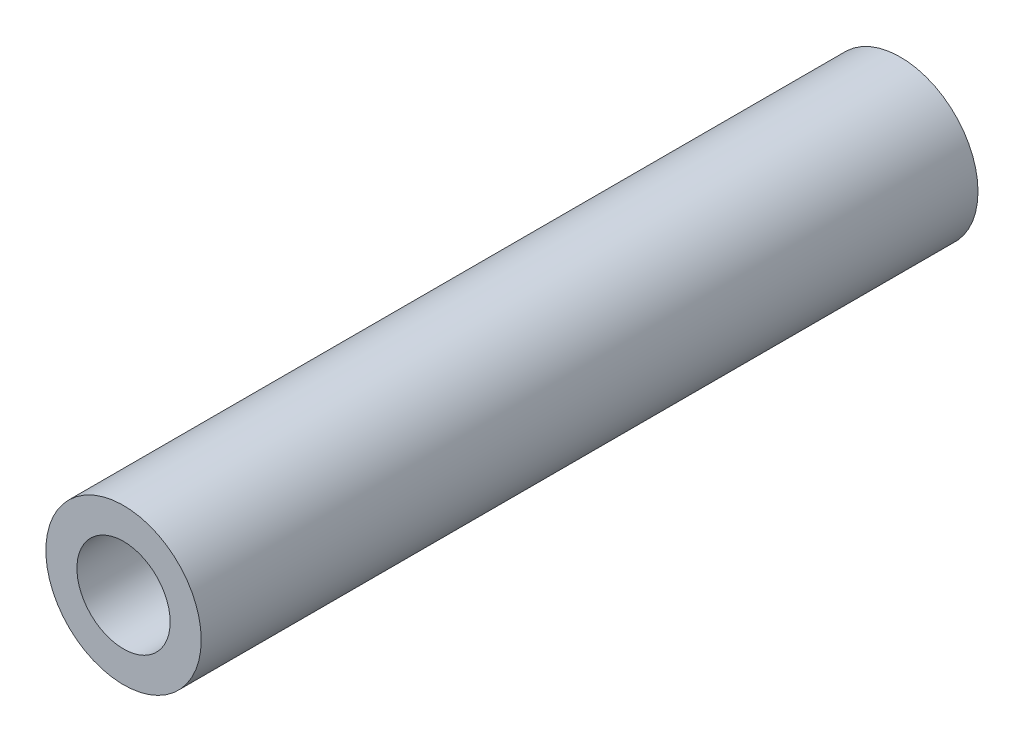
ISO-10303-21;
HEADER;
FILE_DESCRIPTION(('STEP AP214'),'2;1');
FILE_NAME('part.step','',(''),(''),'','','');
FILE_SCHEMA(('AUTOMOTIVE_DESIGN { 1 0 10303 214 1 1 1 1 }'));
ENDSEC;
DATA;
#1=APPLICATION_CONTEXT('core data for automotive mechanical design processes');
#2=APPLICATION_PROTOCOL_DEFINITION('international standard','automotive_design',2000,#1);
#3=PRODUCT_CONTEXT('',#1,'mechanical');
#4=PRODUCT('Part','Part','',(#3));
#5=PRODUCT_RELATED_PRODUCT_CATEGORY('part','',(#4));
#6=PRODUCT_DEFINITION_FORMATION('','',#4);
#7=PRODUCT_DEFINITION_CONTEXT('part definition',#1,'design');
#8=PRODUCT_DEFINITION('design','',#6,#7);
#9=PRODUCT_DEFINITION_SHAPE('','',#8);
#10=(LENGTH_UNIT() NAMED_UNIT(*) SI_UNIT(.MILLI.,.METRE.));
#11=(NAMED_UNIT(*) PLANE_ANGLE_UNIT() SI_UNIT($,.RADIAN.));
#12=(NAMED_UNIT(*) SI_UNIT($,.STERADIAN.) SOLID_ANGLE_UNIT());
#13=UNCERTAINTY_MEASURE_WITH_UNIT(LENGTH_MEASURE(1.E-05),#10,'distance_accuracy_value','');
#14=(GEOMETRIC_REPRESENTATION_CONTEXT(3) GLOBAL_UNCERTAINTY_ASSIGNED_CONTEXT((#13)) GLOBAL_UNIT_ASSIGNED_CONTEXT((#10,
#11,#12)) REPRESENTATION_CONTEXT('',''));
#15=CARTESIAN_POINT('',(0.,0.,0.));
#16=DIRECTION('',(0.,0.,1.));
#17=DIRECTION('',(1.,0.,0.));
#18=AXIS2_PLACEMENT_3D('',#15,#16,#17);
#19=CARTESIAN_POINT('',(0.,0.,25.));
#20=DIRECTION('',(0.,0.,1.));
#21=DIRECTION('',(1.,0.,0.));
#22=AXIS2_PLACEMENT_3D('',#19,#20,#21);
#23=PLANE('',#22);
#24=CARTESIAN_POINT('',(0.,0.,25.));
#25=DIRECTION('',(0.,0.,1.));
#26=DIRECTION('',(1.,0.,0.));
#27=AXIS2_PLACEMENT_3D('',#24,#25,#26);
#28=CIRCLE('',#27,2.5);
#29=CARTESIAN_POINT('',(2.5,0.,25.));
#30=VERTEX_POINT('',#29);
#31=EDGE_CURVE('E10',#30,#30,#28,.T.);
#32=ORIENTED_EDGE('',*,*,#31,.T.);
#33=EDGE_LOOP('',(#32));
#34=FACE_BOUND('',#33,.T.);
#35=CARTESIAN_POINT('',(0.,0.,25.));
#36=DIRECTION('',(0.,0.,1.));
#37=DIRECTION('',(1.,0.,0.));
#38=AXIS2_PLACEMENT_3D('',#35,#36,#37);
#39=CIRCLE('',#38,1.5);
#40=CARTESIAN_POINT('',(1.5,0.,25.));
#41=VERTEX_POINT('',#40);
#42=EDGE_CURVE('E42',#41,#41,#39,.T.);
#43=ORIENTED_EDGE('',*,*,#42,.F.);
#44=EDGE_LOOP('',(#43));
#45=FACE_BOUND('',#44,.T.);
#46=ADVANCED_FACE('F31',(#34,#45),#23,.T.);
#47=CARTESIAN_POINT('',(0.,0.,0.));
#48=DIRECTION('',(0.,0.,1.));
#49=DIRECTION('',(1.,0.,0.));
#50=AXIS2_PLACEMENT_3D('',#47,#48,#49);
#51=PLANE('',#50);
#52=CARTESIAN_POINT('',(0.,0.,0.));
#53=DIRECTION('',(0.,0.,1.));
#54=DIRECTION('',(1.,0.,0.));
#55=AXIS2_PLACEMENT_3D('',#52,#53,#54);
#56=CIRCLE('',#55,2.5);
#57=CARTESIAN_POINT('',(2.5,0.,0.));
#58=VERTEX_POINT('',#57);
#59=EDGE_CURVE('E35',#58,#58,#56,.T.);
#60=ORIENTED_EDGE('',*,*,#59,.F.);
#61=EDGE_LOOP('',(#60));
#62=FACE_BOUND('',#61,.T.);
#63=CARTESIAN_POINT('',(0.,0.,0.));
#64=DIRECTION('',(0.,0.,1.));
#65=DIRECTION('',(1.,0.,0.));
#66=AXIS2_PLACEMENT_3D('',#63,#64,#65);
#67=CIRCLE('',#66,1.5);
#68=CARTESIAN_POINT('',(1.5,0.,0.));
#69=VERTEX_POINT('',#68);
#70=EDGE_CURVE('E44',#69,#69,#67,.T.);
#71=ORIENTED_EDGE('',*,*,#70,.T.);
#72=EDGE_LOOP('',(#71));
#73=FACE_BOUND('',#72,.T.);
#74=ADVANCED_FACE('F54',(#62,#73),#51,.F.);
#75=CARTESIAN_POINT('',(0.,0.,25.));
#76=DIRECTION('',(0.,0.,-1.));
#77=DIRECTION('',(-1.,0.,0.));
#78=AXIS2_PLACEMENT_3D('',#75,#76,#77);
#79=CYLINDRICAL_SURFACE('',#78,2.5);
#80=ORIENTED_EDGE('',*,*,#31,.F.);
#81=EDGE_LOOP('',(#80));
#82=FACE_BOUND('',#81,.T.);
#83=ORIENTED_EDGE('',*,*,#59,.T.);
#84=EDGE_LOOP('',(#83));
#85=FACE_BOUND('',#84,.T.);
#86=ADVANCED_FACE('F33',(#82,#85),#79,.T.);
#87=CARTESIAN_POINT('',(0.,0.,25.));
#88=DIRECTION('',(0.,0.,-1.));
#89=DIRECTION('',(-1.,0.,0.));
#90=AXIS2_PLACEMENT_3D('',#87,#88,#89);
#91=CYLINDRICAL_SURFACE('',#90,1.5);
#92=ORIENTED_EDGE('',*,*,#42,.T.);
#93=EDGE_LOOP('',(#92));
#94=FACE_BOUND('',#93,.T.);
#95=ORIENTED_EDGE('',*,*,#70,.F.);
#96=EDGE_LOOP('',(#95));
#97=FACE_BOUND('',#96,.T.);
#98=ADVANCED_FACE('F50',(#94,#97),#91,.F.);
#99=CLOSED_SHELL('',(#46,#74,#86,#98));
#100=MANIFOLD_SOLID_BREP('B2',#99);
#101=ADVANCED_BREP_SHAPE_REPRESENTATION('',(#18,#100),#14);
#102=SHAPE_DEFINITION_REPRESENTATION(#9,#101);
ENDSEC;
END-ISO-10303-21;
